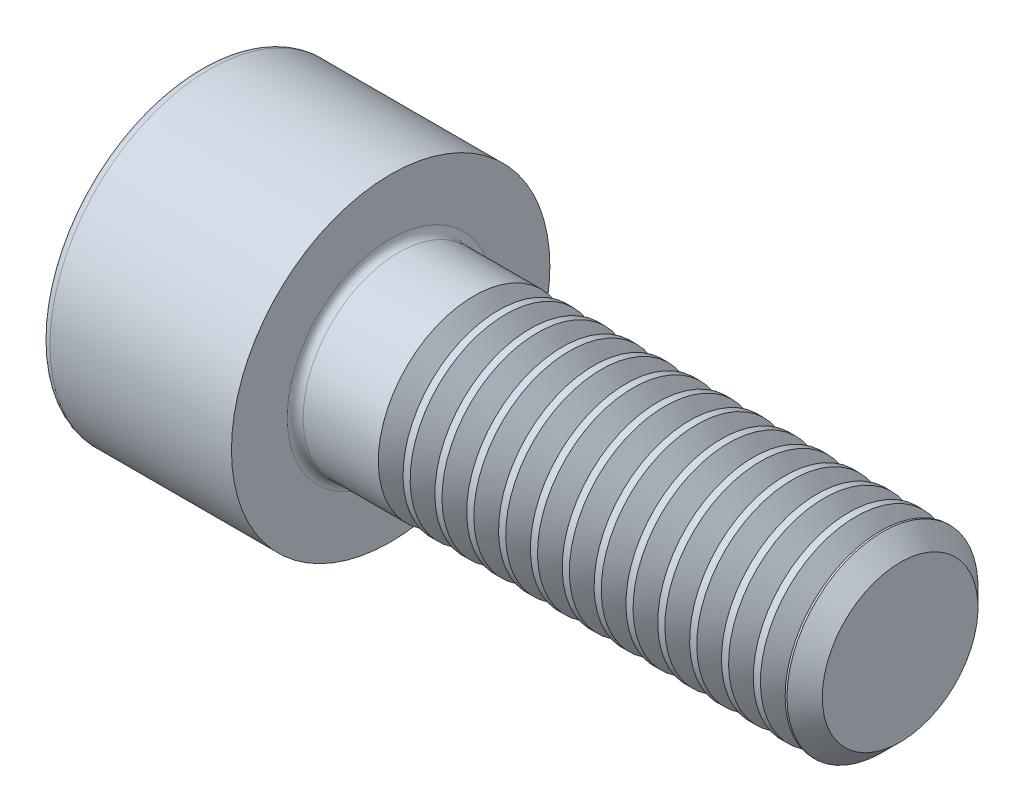
ISO-10303-21;
HEADER;
FILE_DESCRIPTION(('STEP AP214'),'2;1');
FILE_NAME('part.step','',(''),(''),'','','');
FILE_SCHEMA(('AUTOMOTIVE_DESIGN { 1 0 10303 214 1 1 1 1 }'));
ENDSEC;
DATA;
#1=APPLICATION_CONTEXT('core data for automotive mechanical design processes');
#2=APPLICATION_PROTOCOL_DEFINITION('international standard','automotive_design',2000,#1);
#3=PRODUCT_CONTEXT('',#1,'mechanical');
#4=PRODUCT('Part','Part','',(#3));
#5=PRODUCT_RELATED_PRODUCT_CATEGORY('part','',(#4));
#6=PRODUCT_DEFINITION_FORMATION('','',#4);
#7=PRODUCT_DEFINITION_CONTEXT('part definition',#1,'design');
#8=PRODUCT_DEFINITION('design','',#6,#7);
#9=PRODUCT_DEFINITION_SHAPE('','',#8);
#10=(LENGTH_UNIT() NAMED_UNIT(*) SI_UNIT(.MILLI.,.METRE.));
#11=(NAMED_UNIT(*) PLANE_ANGLE_UNIT() SI_UNIT($,.RADIAN.));
#12=(NAMED_UNIT(*) SI_UNIT($,.STERADIAN.) SOLID_ANGLE_UNIT());
#13=UNCERTAINTY_MEASURE_WITH_UNIT(LENGTH_MEASURE(1.E-05),#10,'distance_accuracy_value','');
#14=(GEOMETRIC_REPRESENTATION_CONTEXT(3) GLOBAL_UNCERTAINTY_ASSIGNED_CONTEXT((#13)) GLOBAL_UNIT_ASSIGNED_CONTEXT((#10,
#11,#12)) REPRESENTATION_CONTEXT('',''));
#15=CARTESIAN_POINT('',(0.,0.,0.));
#16=DIRECTION('',(0.,0.,1.));
#17=DIRECTION('',(1.,0.,0.));
#18=AXIS2_PLACEMENT_3D('',#15,#16,#17);
#19=CARTESIAN_POINT('',(0.,0.,0.));
#20=DIRECTION('',(-1.,0.,0.));
#21=DIRECTION('',(0.,0.,1.00000000000001));
#22=AXIS2_PLACEMENT_3D('',#19,#20,#21);
#23=PLANE('',#22);
#24=DIRECTION('',(0.,-0.500000000000004,0.866025403784444));
#25=VECTOR('',#24,1.);
#26=CARTESIAN_POINT('',(0.,2.93524876856003,0.));
#27=LINE('',#26,#25);
#28=CARTESIAN_POINT('',(0.,2.93524876856003,0.));
#29=VERTEX_POINT('',#28);
#30=CARTESIAN_POINT('',(0.,1.46762438428,2.54200000000003));
#31=VERTEX_POINT('',#30);
#32=EDGE_CURVE('E447',#29,#31,#27,.T.);
#33=ORIENTED_EDGE('',*,*,#32,.T.);
#34=DIRECTION('',(0.,1.00000000000001,0.));
#35=VECTOR('',#34,1.);
#36=CARTESIAN_POINT('',(0.,-1.46762438428003,2.54200000000004));
#37=LINE('',#36,#35);
#38=CARTESIAN_POINT('',(0.,-1.46762438428003,2.54200000000004));
#39=VERTEX_POINT('',#38);
#40=EDGE_CURVE('E112',#39,#31,#37,.T.);
#41=ORIENTED_EDGE('',*,*,#40,.F.);
#42=DIRECTION('',(0.,-0.500000000000003,-0.866025403784444));
#43=VECTOR('',#42,1.);
#44=CARTESIAN_POINT('',(0.,-1.46762438428003,2.54200000000004));
#45=LINE('',#44,#43);
#46=CARTESIAN_POINT('',(0.,-2.93524876856011,0.));
#47=VERTEX_POINT('',#46);
#48=EDGE_CURVE('E466',#39,#47,#45,.T.);
#49=ORIENTED_EDGE('',*,*,#48,.T.);
#50=DIRECTION('',(0.,0.500000000000004,-0.866025403784444));
#51=VECTOR('',#50,1.);
#52=CARTESIAN_POINT('',(0.,-2.93524876856011,0.));
#53=LINE('',#52,#51);
#54=CARTESIAN_POINT('',(0.,-1.46762438428007,-2.54199999999997));
#55=VERTEX_POINT('',#54);
#56=EDGE_CURVE('E469',#47,#55,#53,.T.);
#57=ORIENTED_EDGE('',*,*,#56,.T.);
#58=DIRECTION('',(0.,-1.00000000000001,0.));
#59=VECTOR('',#58,1.);
#60=CARTESIAN_POINT('',(0.,1.46762438428002,-2.54199999999998));
#61=LINE('',#60,#59);
#62=CARTESIAN_POINT('',(0.,1.46762438428002,-2.54199999999998));
#63=VERTEX_POINT('',#62);
#64=EDGE_CURVE('E472',#63,#55,#61,.T.);
#65=ORIENTED_EDGE('',*,*,#64,.F.);
#66=DIRECTION('',(0.,-0.500000000000003,-0.866025403784444));
#67=VECTOR('',#66,1.);
#68=CARTESIAN_POINT('',(0.,2.93524876856003,0.));
#69=LINE('',#68,#67);
#70=EDGE_CURVE('E107',#29,#63,#69,.T.);
#71=ORIENTED_EDGE('',*,*,#70,.F.);
#72=EDGE_LOOP('',(#33,#41,#49,#57,#65,#71));
#73=FACE_BOUND('',#72,.T.);
#74=CARTESIAN_POINT('',(0.,0.,0.));
#75=DIRECTION('',(-1.,0.,0.));
#76=DIRECTION('',(0.,0.,1.00000000000001));
#77=AXIS2_PLACEMENT_3D('',#74,#75,#76);
#78=CIRCLE('',#77,4.7);
#79=CARTESIAN_POINT('',(0.,0.,4.70000000000003));
#80=VERTEX_POINT('',#79);
#81=EDGE_CURVE('E24',#80,#80,#78,.T.);
#82=ORIENTED_EDGE('',*,*,#81,.T.);
#83=EDGE_LOOP('',(#82));
#84=FACE_BOUND('',#83,.T.);
#85=ADVANCED_FACE('F16',(#73,#84),#23,.T.);
#86=CARTESIAN_POINT('',(-31.75,0.,0.));
#87=DIRECTION('',(-1.,0.,0.));
#88=DIRECTION('',(0.,0.,1.00000000000001));
#89=AXIS2_PLACEMENT_3D('',#86,#87,#88);
#90=CYLINDRICAL_SURFACE('',#89,5.);
#91=CARTESIAN_POINT('',(0.299999999999995,0.,0.));
#92=DIRECTION('',(-1.,0.,0.));
#93=DIRECTION('',(0.,0.,1.00000000000001));
#94=AXIS2_PLACEMENT_3D('',#91,#92,#93);
#95=CIRCLE('',#94,5.);
#96=CARTESIAN_POINT('',(0.299999999999995,0.,5.00000000000003));
#97=VERTEX_POINT('',#96);
#98=EDGE_CURVE('E11',#97,#97,#95,.F.);
#99=ORIENTED_EDGE('',*,*,#98,.T.);
#100=EDGE_LOOP('',(#99));
#101=FACE_BOUND('',#100,.T.);
#102=CARTESIAN_POINT('',(6.00000000000001,0.,0.));
#103=DIRECTION('',(-1.,0.,0.));
#104=DIRECTION('',(0.,0.,1.00000000000001));
#105=AXIS2_PLACEMENT_3D('',#102,#103,#104);
#106=CIRCLE('',#105,5.);
#107=CARTESIAN_POINT('',(6.00000000000001,0.,5.00000000000003));
#108=VERTEX_POINT('',#107);
#109=EDGE_CURVE('E130',#108,#108,#106,.T.);
#110=ORIENTED_EDGE('',*,*,#109,.T.);
#111=EDGE_LOOP('',(#110));
#112=FACE_BOUND('',#111,.T.);
#113=ADVANCED_FACE('F156',(#101,#112),#90,.T.);
#114=CARTESIAN_POINT('',(6.00000000000001,5.00000000000001,0.));
#115=DIRECTION('',(1.,0.,0.));
#116=DIRECTION('',(0.,0.,-1.00000000000001));
#117=AXIS2_PLACEMENT_3D('',#114,#115,#116);
#118=PLANE('',#117);
#119=CARTESIAN_POINT('',(6.00000000000001,0.,0.));
#120=DIRECTION('',(1.,0.,0.));
#121=DIRECTION('',(0.,0.,-1.00000000000001));
#122=AXIS2_PLACEMENT_3D('',#119,#120,#121);
#123=CIRCLE('',#122,3.25);
#124=CARTESIAN_POINT('',(6.00000000000001,0.,-3.25000000000002));
#125=VERTEX_POINT('',#124);
#126=EDGE_CURVE('E133',#125,#125,#123,.F.);
#127=ORIENTED_EDGE('',*,*,#126,.T.);
#128=EDGE_LOOP('',(#127));
#129=FACE_BOUND('',#128,.T.);
#130=ORIENTED_EDGE('',*,*,#109,.F.);
#131=EDGE_LOOP('',(#130));
#132=FACE_BOUND('',#131,.T.);
#133=ADVANCED_FACE('F163',(#129,#132),#118,.T.);
#134=CARTESIAN_POINT('',(-31.75,0.,0.));
#135=DIRECTION('',(-1.,0.,0.));
#136=DIRECTION('',(0.,0.,1.00000000000001));
#137=AXIS2_PLACEMENT_3D('',#134,#135,#136);
#138=CYLINDRICAL_SURFACE('',#137,3.);
#139=CARTESIAN_POINT('',(8.6117349200627,0.,0.));
#140=DIRECTION('',(-1.,0.,0.));
#141=DIRECTION('',(0.,-1.00000000000001,0.));
#142=AXIS2_PLACEMENT_3D('',#139,#140,#141);
#143=CIRCLE('',#142,3.);
#144=CARTESIAN_POINT('',(8.6117349200627,-3.00000000000002,0.));
#145=VERTEX_POINT('',#144);
#146=EDGE_CURVE('E442',#145,#145,#143,.T.);
#147=ORIENTED_EDGE('',*,*,#146,.T.);
#148=EDGE_LOOP('',(#147));
#149=FACE_BOUND('',#148,.T.);
#150=CARTESIAN_POINT('',(6.25000000000001,0.,0.));
#151=DIRECTION('',(1.,0.,0.));
#152=DIRECTION('',(0.,0.,-1.00000000000001));
#153=AXIS2_PLACEMENT_3D('',#150,#151,#152);
#154=CIRCLE('',#153,3.);
#155=CARTESIAN_POINT('',(6.25000000000001,0.,-3.00000000000002));
#156=VERTEX_POINT('',#155);
#157=EDGE_CURVE('E136',#156,#156,#154,.T.);
#158=ORIENTED_EDGE('',*,*,#157,.T.);
#159=EDGE_LOOP('',(#158));
#160=FACE_BOUND('',#159,.T.);
#161=ADVANCED_FACE('F152',(#149,#160),#138,.T.);
#162=CARTESIAN_POINT('',(6.25000000000001,0.,0.));
#163=DIRECTION('',(1.,0.,0.));
#164=DIRECTION('',(0.,0.,-1.00000000000001));
#165=AXIS2_PLACEMENT_3D('',#162,#163,#164);
#166=TOROIDAL_SURFACE('',#165,3.25,0.25);
#167=ORIENTED_EDGE('',*,*,#157,.F.);
#168=EDGE_LOOP('',(#167));
#169=FACE_BOUND('',#168,.T.);
#170=ORIENTED_EDGE('',*,*,#126,.F.);
#171=EDGE_LOOP('',(#170));
#172=FACE_BOUND('',#171,.T.);
#173=ADVANCED_FACE('F143',(#169,#172),#166,.F.);
#174=CARTESIAN_POINT('',(0.299999999999995,0.,0.));
#175=DIRECTION('',(-1.,0.,0.));
#176=DIRECTION('',(0.,0.,1.00000000000001));
#177=AXIS2_PLACEMENT_3D('',#174,#175,#176);
#178=TOROIDAL_SURFACE('',#177,4.7,0.3);
#179=ORIENTED_EDGE('',*,*,#98,.F.);
#180=EDGE_LOOP('',(#179));
#181=FACE_BOUND('',#180,.T.);
#182=ORIENTED_EDGE('',*,*,#81,.F.);
#183=EDGE_LOOP('',(#182));
#184=FACE_BOUND('',#183,.T.);
#185=ADVANCED_FACE('F18',(#181,#184),#178,.T.);
#186=CARTESIAN_POINT('',(3.,2.93524876856003,0.));
#187=DIRECTION('',(0.,-0.866025403784445,-0.500000000000003));
#188=DIRECTION('',(0.,0.500000000000003,-0.866025403784445));
#189=AXIS2_PLACEMENT_3D('',#186,#187,#188);
#190=PLANE('',#189);
#191=ORIENTED_EDGE('',*,*,#32,.F.);
#192=DIRECTION('',(-1.,0.,0.));
#193=VECTOR('',#192,1.);
#194=CARTESIAN_POINT('',(3.,2.93524876856003,0.));
#195=LINE('',#194,#193);
#196=CARTESIAN_POINT('',(3.,2.93524876856003,0.));
#197=VERTEX_POINT('',#196);
#198=EDGE_CURVE('E463',#197,#29,#195,.T.);
#199=ORIENTED_EDGE('',*,*,#198,.F.);
#200=DIRECTION('',(0.,-0.500000000000004,0.866025403784444));
#201=VECTOR('',#200,1.);
#202=CARTESIAN_POINT('',(3.,2.93524876856003,0.));
#203=LINE('',#202,#201);
#204=CARTESIAN_POINT('',(3.,2.20143657642002,1.27100000000004));
#205=VERTEX_POINT('',#204);
#206=EDGE_CURVE('E99',#197,#205,#203,.T.);
#207=ORIENTED_EDGE('',*,*,#206,.T.);
#208=CARTESIAN_POINT('',(3.,1.46762438428,2.54200000000003));
#209=VERTEX_POINT('',#208);
#210=EDGE_CURVE('E90',#205,#209,#203,.T.);
#211=ORIENTED_EDGE('',*,*,#210,.T.);
#212=DIRECTION('',(-1.,0.,0.));
#213=VECTOR('',#212,1.);
#214=CARTESIAN_POINT('',(3.,1.46762438428,2.54200000000003));
#215=LINE('',#214,#213);
#216=EDGE_CURVE('E104',#209,#31,#215,.T.);
#217=ORIENTED_EDGE('',*,*,#216,.T.);
#218=EDGE_LOOP('',(#191,#199,#207,#211,#217));
#219=FACE_BOUND('',#218,.T.);
#220=ADVANCED_FACE('F103',(#219),#190,.T.);
#221=CARTESIAN_POINT('',(3.,-1.46762438428003,2.54200000000004));
#222=DIRECTION('',(0.,0.,1.00000000000001));
#223=DIRECTION('',(0.,-1.00000000000001,0.));
#224=AXIS2_PLACEMENT_3D('',#221,#222,#223);
#225=PLANE('',#224);
#226=ORIENTED_EDGE('',*,*,#40,.T.);
#227=ORIENTED_EDGE('',*,*,#216,.F.);
#228=DIRECTION('',(0.,1.00000000000001,0.));
#229=VECTOR('',#228,1.);
#230=CARTESIAN_POINT('',(3.,-1.46762438428003,2.54200000000004));
#231=LINE('',#230,#229);
#232=CARTESIAN_POINT('',(3.,0.,2.542));
#233=VERTEX_POINT('',#232);
#234=EDGE_CURVE('E87',#233,#209,#231,.T.);
#235=ORIENTED_EDGE('',*,*,#234,.F.);
#236=CARTESIAN_POINT('',(3.,-1.46762438428003,2.54200000000004));
#237=VERTEX_POINT('',#236);
#238=EDGE_CURVE('E98',#237,#233,#231,.T.);
#239=ORIENTED_EDGE('',*,*,#238,.F.);
#240=DIRECTION('',(-1.,0.,0.));
#241=VECTOR('',#240,1.);
#242=CARTESIAN_POINT('',(3.,-1.46762438428003,2.54200000000004));
#243=LINE('',#242,#241);
#244=EDGE_CURVE('E114',#237,#39,#243,.T.);
#245=ORIENTED_EDGE('',*,*,#244,.T.);
#246=EDGE_LOOP('',(#226,#227,#235,#239,#245));
#247=FACE_BOUND('',#246,.T.);
#248=ADVANCED_FACE('F109',(#247),#225,.F.);
#249=CARTESIAN_POINT('',(3.,-1.46762438428003,2.54200000000004));
#250=DIRECTION('',(0.,0.866025403784444,-0.500000000000003));
#251=DIRECTION('',(0.,0.500000000000003,0.866025403784444));
#252=AXIS2_PLACEMENT_3D('',#249,#250,#251);
#253=PLANE('',#252);
#254=ORIENTED_EDGE('',*,*,#48,.F.);
#255=ORIENTED_EDGE('',*,*,#244,.F.);
#256=DIRECTION('',(0.,-0.500000000000003,-0.866025403784444));
#257=VECTOR('',#256,1.);
#258=CARTESIAN_POINT('',(3.,-1.46762438428003,2.54200000000004));
#259=LINE('',#258,#257);
#260=CARTESIAN_POINT('',(3.,-2.20143657642007,1.27100000000001));
#261=VERTEX_POINT('',#260);
#262=EDGE_CURVE('E450',#237,#261,#259,.T.);
#263=ORIENTED_EDGE('',*,*,#262,.T.);
#264=CARTESIAN_POINT('',(3.,-2.93524876856011,0.));
#265=VERTEX_POINT('',#264);
#266=EDGE_CURVE('E449',#261,#265,#259,.T.);
#267=ORIENTED_EDGE('',*,*,#266,.T.);
#268=DIRECTION('',(-1.,0.,0.));
#269=VECTOR('',#268,1.);
#270=CARTESIAN_POINT('',(3.,-2.93524876856011,0.));
#271=LINE('',#270,#269);
#272=EDGE_CURVE('E119',#265,#47,#271,.T.);
#273=ORIENTED_EDGE('',*,*,#272,.T.);
#274=EDGE_LOOP('',(#254,#255,#263,#267,#273));
#275=FACE_BOUND('',#274,.T.);
#276=ADVANCED_FACE('F191',(#275),#253,.T.);
#277=CARTESIAN_POINT('',(3.,-2.93524876856011,0.));
#278=DIRECTION('',(0.,0.866025403784445,0.500000000000003));
#279=DIRECTION('',(0.,-0.500000000000003,0.866025403784445));
#280=AXIS2_PLACEMENT_3D('',#277,#278,#279);
#281=PLANE('',#280);
#282=ORIENTED_EDGE('',*,*,#56,.F.);
#283=ORIENTED_EDGE('',*,*,#272,.F.);
#284=DIRECTION('',(0.,0.500000000000004,-0.866025403784444));
#285=VECTOR('',#284,1.);
#286=CARTESIAN_POINT('',(3.,-2.93524876856011,0.));
#287=LINE('',#286,#285);
#288=CARTESIAN_POINT('',(3.,-2.2014365764201,-1.271));
#289=VERTEX_POINT('',#288);
#290=EDGE_CURVE('E454',#265,#289,#287,.T.);
#291=ORIENTED_EDGE('',*,*,#290,.T.);
#292=CARTESIAN_POINT('',(3.,-1.46762438428007,-2.54199999999997));
#293=VERTEX_POINT('',#292);
#294=EDGE_CURVE('E453',#289,#293,#287,.T.);
#295=ORIENTED_EDGE('',*,*,#294,.T.);
#296=DIRECTION('',(-1.,0.,0.));
#297=VECTOR('',#296,1.);
#298=CARTESIAN_POINT('',(3.,-1.46762438428007,-2.54199999999997));
#299=LINE('',#298,#297);
#300=EDGE_CURVE('E481',#293,#55,#299,.T.);
#301=ORIENTED_EDGE('',*,*,#300,.T.);
#302=EDGE_LOOP('',(#282,#283,#291,#295,#301));
#303=FACE_BOUND('',#302,.T.);
#304=ADVANCED_FACE('F194',(#303),#281,.T.);
#305=CARTESIAN_POINT('',(3.,1.46762438428002,-2.54199999999998));
#306=DIRECTION('',(0.,0.,-1.00000000000001));
#307=DIRECTION('',(0.,1.00000000000001,0.));
#308=AXIS2_PLACEMENT_3D('',#305,#306,#307);
#309=PLANE('',#308);
#310=ORIENTED_EDGE('',*,*,#64,.T.);
#311=ORIENTED_EDGE('',*,*,#300,.F.);
#312=DIRECTION('',(0.,-1.00000000000001,0.));
#313=VECTOR('',#312,1.);
#314=CARTESIAN_POINT('',(3.,1.46762438428002,-2.54199999999998));
#315=LINE('',#314,#313);
#316=CARTESIAN_POINT('',(3.,0.,-2.54199999999999));
#317=VERTEX_POINT('',#316);
#318=EDGE_CURVE('E457',#317,#293,#315,.T.);
#319=ORIENTED_EDGE('',*,*,#318,.F.);
#320=CARTESIAN_POINT('',(3.,1.46762438428002,-2.54199999999998));
#321=VERTEX_POINT('',#320);
#322=EDGE_CURVE('E31',#321,#317,#315,.T.);
#323=ORIENTED_EDGE('',*,*,#322,.F.);
#324=DIRECTION('',(-1.,0.,0.));
#325=VECTOR('',#324,1.);
#326=CARTESIAN_POINT('',(3.,1.46762438428002,-2.54199999999998));
#327=LINE('',#326,#325);
#328=EDGE_CURVE('E478',#321,#63,#327,.T.);
#329=ORIENTED_EDGE('',*,*,#328,.T.);
#330=EDGE_LOOP('',(#310,#311,#319,#323,#329));
#331=FACE_BOUND('',#330,.T.);
#332=ADVANCED_FACE('F198',(#331),#309,.F.);
#333=CARTESIAN_POINT('',(3.,2.93524876856003,0.));
#334=DIRECTION('',(0.,0.866025403784444,-0.500000000000003));
#335=DIRECTION('',(0.,0.500000000000003,0.866025403784444));
#336=AXIS2_PLACEMENT_3D('',#333,#334,#335);
#337=PLANE('',#336);
#338=ORIENTED_EDGE('',*,*,#70,.T.);
#339=ORIENTED_EDGE('',*,*,#328,.F.);
#340=DIRECTION('',(0.,-0.500000000000003,-0.866025403784444));
#341=VECTOR('',#340,1.);
#342=CARTESIAN_POINT('',(3.,2.93524876856003,0.));
#343=LINE('',#342,#341);
#344=CARTESIAN_POINT('',(3.,2.20143657642002,-1.27099999999997));
#345=VERTEX_POINT('',#344);
#346=EDGE_CURVE('E459',#345,#321,#343,.T.);
#347=ORIENTED_EDGE('',*,*,#346,.F.);
#348=EDGE_CURVE('E460',#197,#345,#343,.T.);
#349=ORIENTED_EDGE('',*,*,#348,.F.);
#350=ORIENTED_EDGE('',*,*,#198,.T.);
#351=EDGE_LOOP('',(#338,#339,#347,#349,#350));
#352=FACE_BOUND('',#351,.T.);
#353=ADVANCED_FACE('F202',(#352),#337,.F.);
#354=CARTESIAN_POINT('',(3.,4.40287315284007,-2.54199999999999));
#355=DIRECTION('',(1.,0.,0.));
#356=DIRECTION('',(0.,0.,-1.00000000000001));
#357=AXIS2_PLACEMENT_3D('',#354,#355,#356);
#358=PLANE('',#357);
#359=ORIENTED_EDGE('',*,*,#318,.T.);
#360=ORIENTED_EDGE('',*,*,#294,.F.);
#361=CARTESIAN_POINT('',(3.,0.,0.));
#362=DIRECTION('',(-1.,0.,0.));
#363=DIRECTION('',(0.,0.,1.00000000000001));
#364=AXIS2_PLACEMENT_3D('',#361,#362,#363);
#365=CIRCLE('',#364,2.542);
#366=EDGE_CURVE('E498',#317,#289,#365,.T.);
#367=ORIENTED_EDGE('',*,*,#366,.F.);
#368=EDGE_LOOP('',(#359,#360,#367));
#369=FACE_BOUND('',#368,.T.);
#370=ADVANCED_FACE('F206',(#369),#358,.F.);
#371=ORIENTED_EDGE('',*,*,#290,.F.);
#372=ORIENTED_EDGE('',*,*,#266,.F.);
#373=EDGE_CURVE('E117',#289,#261,#365,.T.);
#374=ORIENTED_EDGE('',*,*,#373,.F.);
#375=EDGE_LOOP('',(#371,#372,#374));
#376=FACE_BOUND('',#375,.T.);
#377=ADVANCED_FACE('F210',(#376),#358,.F.);
#378=ORIENTED_EDGE('',*,*,#262,.F.);
#379=ORIENTED_EDGE('',*,*,#238,.T.);
#380=EDGE_CURVE('E113',#261,#233,#365,.T.);
#381=ORIENTED_EDGE('',*,*,#380,.F.);
#382=EDGE_LOOP('',(#378,#379,#381));
#383=FACE_BOUND('',#382,.T.);
#384=ADVANCED_FACE('F507',(#383),#358,.F.);
#385=ORIENTED_EDGE('',*,*,#234,.T.);
#386=ORIENTED_EDGE('',*,*,#210,.F.);
#387=EDGE_CURVE('E93',#233,#205,#365,.T.);
#388=ORIENTED_EDGE('',*,*,#387,.F.);
#389=EDGE_LOOP('',(#385,#386,#388));
#390=FACE_BOUND('',#389,.T.);
#391=ADVANCED_FACE('F89',(#390),#358,.F.);
#392=ORIENTED_EDGE('',*,*,#206,.F.);
#393=ORIENTED_EDGE('',*,*,#348,.T.);
#394=EDGE_CURVE('E124',#205,#345,#365,.T.);
#395=ORIENTED_EDGE('',*,*,#394,.F.);
#396=EDGE_LOOP('',(#392,#393,#395));
#397=FACE_BOUND('',#396,.T.);
#398=ADVANCED_FACE('F493',(#397),#358,.F.);
#399=ORIENTED_EDGE('',*,*,#346,.T.);
#400=ORIENTED_EDGE('',*,*,#322,.T.);
#401=EDGE_CURVE('E497',#345,#317,#365,.T.);
#402=ORIENTED_EDGE('',*,*,#401,.F.);
#403=EDGE_LOOP('',(#399,#400,#402));
#404=FACE_BOUND('',#403,.T.);
#405=ADVANCED_FACE('F187',(#404),#358,.F.);
#406=CARTESIAN_POINT('',(3.,0.,0.));
#407=DIRECTION('',(-1.,0.,0.));
#408=DIRECTION('',(0.,0.,1.00000000000001));
#409=AXIS2_PLACEMENT_3D('',#406,#407,#408);
#410=CONICAL_SURFACE('',#409,2.542,1.0471975511966);
#411=CARTESIAN_POINT('',(4.46762438428006,0.,0.));
#412=VERTEX_POINT('',#411);
#413=VERTEX_LOOP('',#412);
#414=FACE_BOUND('',#413,.T.);
#415=ORIENTED_EDGE('',*,*,#387,.T.);
#416=ORIENTED_EDGE('',*,*,#394,.T.);
#417=ORIENTED_EDGE('',*,*,#401,.T.);
#418=ORIENTED_EDGE('',*,*,#366,.T.);
#419=ORIENTED_EDGE('',*,*,#373,.T.);
#420=ORIENTED_EDGE('',*,*,#380,.T.);
#421=EDGE_LOOP('',(#415,#416,#417,#418,#419,#420));
#422=FACE_BOUND('',#421,.T.);
#423=ADVANCED_FACE('F184',(#414,#422),#410,.F.);
#424=CARTESIAN_POINT('',(9.38826507993729,0.,0.));
#425=DIRECTION('',(1.,0.,0.));
#426=DIRECTION('',(0.,1.00000000000001,0.));
#427=AXIS2_PLACEMENT_3D('',#424,#425,#426);
#428=CONICAL_SURFACE('',#427,3.,0.959931088596881);
#429=CARTESIAN_POINT('',(9.00000000000001,0.,0.));
#430=DIRECTION('',(-1.,0.,0.));
#431=DIRECTION('',(0.,-1.00000000000001,0.));
#432=AXIS2_PLACEMENT_3D('',#429,#430,#431);
#433=CIRCLE('',#432,2.4455);
#434=CARTESIAN_POINT('',(9.00000000000001,-2.44550000000002,0.));
#435=VERTEX_POINT('',#434);
#436=EDGE_CURVE('E439',#435,#435,#433,.T.);
#437=ORIENTED_EDGE('',*,*,#436,.F.);
#438=EDGE_LOOP('',(#437));
#439=FACE_BOUND('',#438,.T.);
#440=CARTESIAN_POINT('',(9.38826507993729,0.,0.));
#441=DIRECTION('',(-1.,0.,0.));
#442=DIRECTION('',(0.,-1.00000000000001,0.));
#443=AXIS2_PLACEMENT_3D('',#440,#441,#442);
#444=CIRCLE('',#443,3.);
#445=CARTESIAN_POINT('',(9.38826507993729,-3.00000000000002,0.));
#446=VERTEX_POINT('',#445);
#447=EDGE_CURVE('E445',#446,#446,#444,.T.);
#448=ORIENTED_EDGE('',*,*,#447,.T.);
#449=EDGE_LOOP('',(#448));
#450=FACE_BOUND('',#449,.T.);
#451=ADVANCED_FACE('F186',(#439,#450),#428,.T.);
#452=CARTESIAN_POINT('',(9.00000000000001,0.,0.));
#453=DIRECTION('',(-1.,0.,0.));
#454=DIRECTION('',(0.,-1.00000000000001,0.));
#455=AXIS2_PLACEMENT_3D('',#452,#453,#454);
#456=CONICAL_SURFACE('',#455,2.4455,0.959931088596877);
#457=ORIENTED_EDGE('',*,*,#146,.F.);
#458=EDGE_LOOP('',(#457));
#459=FACE_BOUND('',#458,.T.);
#460=ORIENTED_EDGE('',*,*,#436,.T.);
#461=EDGE_LOOP('',(#460));
#462=FACE_BOUND('',#461,.T.);
#463=ADVANCED_FACE('F214',(#459,#462),#456,.T.);
#464=CARTESIAN_POINT('',(9.6117349200627,0.,0.));
#465=DIRECTION('',(-1.,0.,0.));
#466=DIRECTION('',(0.,-1.00000000000001,0.));
#467=AXIS2_PLACEMENT_3D('',#464,#465,#466);
#468=CIRCLE('',#467,3.);
#469=CARTESIAN_POINT('',(9.6117349200627,-3.00000000000002,0.));
#470=VERTEX_POINT('',#469);
#471=EDGE_CURVE('E433',#470,#470,#468,.T.);
#472=ORIENTED_EDGE('',*,*,#471,.T.);
#473=EDGE_LOOP('',(#472));
#474=FACE_BOUND('',#473,.T.);
#475=ORIENTED_EDGE('',*,*,#447,.F.);
#476=EDGE_LOOP('',(#475));
#477=FACE_BOUND('',#476,.T.);
#478=ADVANCED_FACE('F174',(#474,#477),#138,.T.);
#479=CARTESIAN_POINT('',(10.3882650799373,0.,0.));
#480=DIRECTION('',(1.,0.,0.));
#481=DIRECTION('',(0.,1.00000000000001,0.));
#482=AXIS2_PLACEMENT_3D('',#479,#480,#481);
#483=CONICAL_SURFACE('',#482,3.,0.959931088596881);
#484=CARTESIAN_POINT('',(10.,0.,0.));
#485=DIRECTION('',(-1.,0.,0.));
#486=DIRECTION('',(0.,-1.00000000000001,0.));
#487=AXIS2_PLACEMENT_3D('',#484,#485,#486);
#488=CIRCLE('',#487,2.4455);
#489=CARTESIAN_POINT('',(10.,-2.44550000000002,0.));
#490=VERTEX_POINT('',#489);
#491=EDGE_CURVE('E430',#490,#490,#488,.T.);
#492=ORIENTED_EDGE('',*,*,#491,.F.);
#493=EDGE_LOOP('',(#492));
#494=FACE_BOUND('',#493,.T.);
#495=CARTESIAN_POINT('',(10.3882650799373,0.,0.));
#496=DIRECTION('',(-1.,0.,0.));
#497=DIRECTION('',(0.,-1.00000000000001,0.));
#498=AXIS2_PLACEMENT_3D('',#495,#496,#497);
#499=CIRCLE('',#498,3.);
#500=CARTESIAN_POINT('',(10.3882650799373,-3.00000000000002,0.));
#501=VERTEX_POINT('',#500);
#502=EDGE_CURVE('E436',#501,#501,#499,.T.);
#503=ORIENTED_EDGE('',*,*,#502,.T.);
#504=EDGE_LOOP('',(#503));
#505=FACE_BOUND('',#504,.T.);
#506=ADVANCED_FACE('F219',(#494,#505),#483,.T.);
#507=CARTESIAN_POINT('',(10.,0.,0.));
#508=DIRECTION('',(-1.,0.,0.));
#509=DIRECTION('',(0.,-1.00000000000001,0.));
#510=AXIS2_PLACEMENT_3D('',#507,#508,#509);
#511=CONICAL_SURFACE('',#510,2.4455,0.959931088596877);
#512=ORIENTED_EDGE('',*,*,#471,.F.);
#513=EDGE_LOOP('',(#512));
#514=FACE_BOUND('',#513,.T.);
#515=ORIENTED_EDGE('',*,*,#491,.T.);
#516=EDGE_LOOP('',(#515));
#517=FACE_BOUND('',#516,.T.);
#518=ADVANCED_FACE('F222',(#514,#517),#511,.T.);
#519=CARTESIAN_POINT('',(10.6117349200627,0.,0.));
#520=DIRECTION('',(-1.,0.,0.));
#521=DIRECTION('',(0.,-1.00000000000001,0.));
#522=AXIS2_PLACEMENT_3D('',#519,#520,#521);
#523=CIRCLE('',#522,3.);
#524=CARTESIAN_POINT('',(10.6117349200627,-3.00000000000002,0.));
#525=VERTEX_POINT('',#524);
#526=EDGE_CURVE('E424',#525,#525,#523,.T.);
#527=ORIENTED_EDGE('',*,*,#526,.T.);
#528=EDGE_LOOP('',(#527));
#529=FACE_BOUND('',#528,.T.);
#530=ORIENTED_EDGE('',*,*,#502,.F.);
#531=EDGE_LOOP('',(#530));
#532=FACE_BOUND('',#531,.T.);
#533=ADVANCED_FACE('F226',(#529,#532),#138,.T.);
#534=CARTESIAN_POINT('',(11.3882650799373,0.,0.));
#535=DIRECTION('',(1.,0.,0.));
#536=DIRECTION('',(0.,1.00000000000001,0.));
#537=AXIS2_PLACEMENT_3D('',#534,#535,#536);
#538=CONICAL_SURFACE('',#537,3.,0.959931088596881);
#539=CARTESIAN_POINT('',(11.,0.,0.));
#540=DIRECTION('',(-1.,0.,0.));
#541=DIRECTION('',(0.,-1.00000000000001,0.));
#542=AXIS2_PLACEMENT_3D('',#539,#540,#541);
#543=CIRCLE('',#542,2.4455);
#544=CARTESIAN_POINT('',(11.,-2.44550000000002,0.));
#545=VERTEX_POINT('',#544);
#546=EDGE_CURVE('E421',#545,#545,#543,.T.);
#547=ORIENTED_EDGE('',*,*,#546,.F.);
#548=EDGE_LOOP('',(#547));
#549=FACE_BOUND('',#548,.T.);
#550=CARTESIAN_POINT('',(11.3882650799373,0.,0.));
#551=DIRECTION('',(-1.,0.,0.));
#552=DIRECTION('',(0.,-1.00000000000001,0.));
#553=AXIS2_PLACEMENT_3D('',#550,#551,#552);
#554=CIRCLE('',#553,3.);
#555=CARTESIAN_POINT('',(11.3882650799373,-3.00000000000002,0.));
#556=VERTEX_POINT('',#555);
#557=EDGE_CURVE('E427',#556,#556,#554,.T.);
#558=ORIENTED_EDGE('',*,*,#557,.T.);
#559=EDGE_LOOP('',(#558));
#560=FACE_BOUND('',#559,.T.);
#561=ADVANCED_FACE('F228',(#549,#560),#538,.T.);
#562=CARTESIAN_POINT('',(11.,0.,0.));
#563=DIRECTION('',(-1.,0.,0.));
#564=DIRECTION('',(0.,-1.00000000000001,0.));
#565=AXIS2_PLACEMENT_3D('',#562,#563,#564);
#566=CONICAL_SURFACE('',#565,2.4455,0.959931088596877);
#567=ORIENTED_EDGE('',*,*,#526,.F.);
#568=EDGE_LOOP('',(#567));
#569=FACE_BOUND('',#568,.T.);
#570=ORIENTED_EDGE('',*,*,#546,.T.);
#571=EDGE_LOOP('',(#570));
#572=FACE_BOUND('',#571,.T.);
#573=ADVANCED_FACE('F231',(#569,#572),#566,.T.);
#574=CARTESIAN_POINT('',(11.6117349200627,0.,0.));
#575=DIRECTION('',(-1.,0.,0.));
#576=DIRECTION('',(0.,-1.00000000000001,0.));
#577=AXIS2_PLACEMENT_3D('',#574,#575,#576);
#578=CIRCLE('',#577,3.);
#579=CARTESIAN_POINT('',(11.6117349200627,-3.00000000000002,0.));
#580=VERTEX_POINT('',#579);
#581=EDGE_CURVE('E415',#580,#580,#578,.T.);
#582=ORIENTED_EDGE('',*,*,#581,.T.);
#583=EDGE_LOOP('',(#582));
#584=FACE_BOUND('',#583,.T.);
#585=ORIENTED_EDGE('',*,*,#557,.F.);
#586=EDGE_LOOP('',(#585));
#587=FACE_BOUND('',#586,.T.);
#588=ADVANCED_FACE('F235',(#584,#587),#138,.T.);
#589=CARTESIAN_POINT('',(12.3882650799373,0.,0.));
#590=DIRECTION('',(1.,0.,0.));
#591=DIRECTION('',(0.,1.00000000000001,0.));
#592=AXIS2_PLACEMENT_3D('',#589,#590,#591);
#593=CONICAL_SURFACE('',#592,3.,0.959931088596881);
#594=CARTESIAN_POINT('',(12.,0.,0.));
#595=DIRECTION('',(-1.,0.,0.));
#596=DIRECTION('',(0.,-1.00000000000001,0.));
#597=AXIS2_PLACEMENT_3D('',#594,#595,#596);
#598=CIRCLE('',#597,2.4455);
#599=CARTESIAN_POINT('',(12.,-2.44550000000002,0.));
#600=VERTEX_POINT('',#599);
#601=EDGE_CURVE('E412',#600,#600,#598,.T.);
#602=ORIENTED_EDGE('',*,*,#601,.F.);
#603=EDGE_LOOP('',(#602));
#604=FACE_BOUND('',#603,.T.);
#605=CARTESIAN_POINT('',(12.3882650799373,0.,0.));
#606=DIRECTION('',(-1.,0.,0.));
#607=DIRECTION('',(0.,-1.00000000000001,0.));
#608=AXIS2_PLACEMENT_3D('',#605,#606,#607);
#609=CIRCLE('',#608,3.);
#610=CARTESIAN_POINT('',(12.3882650799373,-3.00000000000002,0.));
#611=VERTEX_POINT('',#610);
#612=EDGE_CURVE('E418',#611,#611,#609,.T.);
#613=ORIENTED_EDGE('',*,*,#612,.T.);
#614=EDGE_LOOP('',(#613));
#615=FACE_BOUND('',#614,.T.);
#616=ADVANCED_FACE('F237',(#604,#615),#593,.T.);
#617=CARTESIAN_POINT('',(12.,0.,0.));
#618=DIRECTION('',(-1.,0.,0.));
#619=DIRECTION('',(0.,-1.00000000000001,0.));
#620=AXIS2_PLACEMENT_3D('',#617,#618,#619);
#621=CONICAL_SURFACE('',#620,2.4455,0.959931088596877);
#622=ORIENTED_EDGE('',*,*,#581,.F.);
#623=EDGE_LOOP('',(#622));
#624=FACE_BOUND('',#623,.T.);
#625=ORIENTED_EDGE('',*,*,#601,.T.);
#626=EDGE_LOOP('',(#625));
#627=FACE_BOUND('',#626,.T.);
#628=ADVANCED_FACE('F240',(#624,#627),#621,.T.);
#629=CARTESIAN_POINT('',(12.6117349200627,0.,0.));
#630=DIRECTION('',(-1.,0.,0.));
#631=DIRECTION('',(0.,-1.00000000000001,0.));
#632=AXIS2_PLACEMENT_3D('',#629,#630,#631);
#633=CIRCLE('',#632,3.);
#634=CARTESIAN_POINT('',(12.6117349200627,-3.00000000000002,0.));
#635=VERTEX_POINT('',#634);
#636=EDGE_CURVE('E406',#635,#635,#633,.T.);
#637=ORIENTED_EDGE('',*,*,#636,.T.);
#638=EDGE_LOOP('',(#637));
#639=FACE_BOUND('',#638,.T.);
#640=ORIENTED_EDGE('',*,*,#612,.F.);
#641=EDGE_LOOP('',(#640));
#642=FACE_BOUND('',#641,.T.);
#643=ADVANCED_FACE('F244',(#639,#642),#138,.T.);
#644=CARTESIAN_POINT('',(13.3882650799373,0.,0.));
#645=DIRECTION('',(1.,0.,0.));
#646=DIRECTION('',(0.,1.00000000000001,0.));
#647=AXIS2_PLACEMENT_3D('',#644,#645,#646);
#648=CONICAL_SURFACE('',#647,3.,0.959931088596881);
#649=CARTESIAN_POINT('',(13.,0.,0.));
#650=DIRECTION('',(-1.,0.,0.));
#651=DIRECTION('',(0.,-1.00000000000001,0.));
#652=AXIS2_PLACEMENT_3D('',#649,#650,#651);
#653=CIRCLE('',#652,2.4455);
#654=CARTESIAN_POINT('',(13.,-2.44550000000002,0.));
#655=VERTEX_POINT('',#654);
#656=EDGE_CURVE('E403',#655,#655,#653,.T.);
#657=ORIENTED_EDGE('',*,*,#656,.F.);
#658=EDGE_LOOP('',(#657));
#659=FACE_BOUND('',#658,.T.);
#660=CARTESIAN_POINT('',(13.3882650799373,0.,0.));
#661=DIRECTION('',(-1.,0.,0.));
#662=DIRECTION('',(0.,-1.00000000000001,0.));
#663=AXIS2_PLACEMENT_3D('',#660,#661,#662);
#664=CIRCLE('',#663,3.);
#665=CARTESIAN_POINT('',(13.3882650799373,-3.00000000000002,0.));
#666=VERTEX_POINT('',#665);
#667=EDGE_CURVE('E409',#666,#666,#664,.T.);
#668=ORIENTED_EDGE('',*,*,#667,.T.);
#669=EDGE_LOOP('',(#668));
#670=FACE_BOUND('',#669,.T.);
#671=ADVANCED_FACE('F246',(#659,#670),#648,.T.);
#672=CARTESIAN_POINT('',(13.,0.,0.));
#673=DIRECTION('',(-1.,0.,0.));
#674=DIRECTION('',(0.,-1.00000000000001,0.));
#675=AXIS2_PLACEMENT_3D('',#672,#673,#674);
#676=CONICAL_SURFACE('',#675,2.4455,0.959931088596877);
#677=ORIENTED_EDGE('',*,*,#636,.F.);
#678=EDGE_LOOP('',(#677));
#679=FACE_BOUND('',#678,.T.);
#680=ORIENTED_EDGE('',*,*,#656,.T.);
#681=EDGE_LOOP('',(#680));
#682=FACE_BOUND('',#681,.T.);
#683=ADVANCED_FACE('F249',(#679,#682),#676,.T.);
#684=CARTESIAN_POINT('',(13.6117349200627,0.,0.));
#685=DIRECTION('',(-1.,0.,0.));
#686=DIRECTION('',(0.,-1.00000000000001,0.));
#687=AXIS2_PLACEMENT_3D('',#684,#685,#686);
#688=CIRCLE('',#687,3.);
#689=CARTESIAN_POINT('',(13.6117349200627,-3.00000000000002,0.));
#690=VERTEX_POINT('',#689);
#691=EDGE_CURVE('E397',#690,#690,#688,.T.);
#692=ORIENTED_EDGE('',*,*,#691,.T.);
#693=EDGE_LOOP('',(#692));
#694=FACE_BOUND('',#693,.T.);
#695=ORIENTED_EDGE('',*,*,#667,.F.);
#696=EDGE_LOOP('',(#695));
#697=FACE_BOUND('',#696,.T.);
#698=ADVANCED_FACE('F253',(#694,#697),#138,.T.);
#699=CARTESIAN_POINT('',(14.3882650799373,0.,0.));
#700=DIRECTION('',(1.,0.,0.));
#701=DIRECTION('',(0.,1.00000000000001,0.));
#702=AXIS2_PLACEMENT_3D('',#699,#700,#701);
#703=CONICAL_SURFACE('',#702,3.,0.959931088596881);
#704=CARTESIAN_POINT('',(14.,0.,0.));
#705=DIRECTION('',(-1.,0.,0.));
#706=DIRECTION('',(0.,-1.00000000000001,0.));
#707=AXIS2_PLACEMENT_3D('',#704,#705,#706);
#708=CIRCLE('',#707,2.4455);
#709=CARTESIAN_POINT('',(14.,-2.44550000000002,0.));
#710=VERTEX_POINT('',#709);
#711=EDGE_CURVE('E394',#710,#710,#708,.T.);
#712=ORIENTED_EDGE('',*,*,#711,.F.);
#713=EDGE_LOOP('',(#712));
#714=FACE_BOUND('',#713,.T.);
#715=CARTESIAN_POINT('',(14.3882650799373,0.,0.));
#716=DIRECTION('',(-1.,0.,0.));
#717=DIRECTION('',(0.,-1.00000000000001,0.));
#718=AXIS2_PLACEMENT_3D('',#715,#716,#717);
#719=CIRCLE('',#718,3.);
#720=CARTESIAN_POINT('',(14.3882650799373,-3.00000000000002,0.));
#721=VERTEX_POINT('',#720);
#722=EDGE_CURVE('E400',#721,#721,#719,.T.);
#723=ORIENTED_EDGE('',*,*,#722,.T.);
#724=EDGE_LOOP('',(#723));
#725=FACE_BOUND('',#724,.T.);
#726=ADVANCED_FACE('F255',(#714,#725),#703,.T.);
#727=CARTESIAN_POINT('',(14.,0.,0.));
#728=DIRECTION('',(-1.,0.,0.));
#729=DIRECTION('',(0.,-1.00000000000001,0.));
#730=AXIS2_PLACEMENT_3D('',#727,#728,#729);
#731=CONICAL_SURFACE('',#730,2.4455,0.959931088596877);
#732=ORIENTED_EDGE('',*,*,#691,.F.);
#733=EDGE_LOOP('',(#732));
#734=FACE_BOUND('',#733,.T.);
#735=ORIENTED_EDGE('',*,*,#711,.T.);
#736=EDGE_LOOP('',(#735));
#737=FACE_BOUND('',#736,.T.);
#738=ADVANCED_FACE('F258',(#734,#737),#731,.T.);
#739=CARTESIAN_POINT('',(14.6117349200627,0.,0.));
#740=DIRECTION('',(-1.,0.,0.));
#741=DIRECTION('',(0.,-1.00000000000001,0.));
#742=AXIS2_PLACEMENT_3D('',#739,#740,#741);
#743=CIRCLE('',#742,3.);
#744=CARTESIAN_POINT('',(14.6117349200627,-3.00000000000002,0.));
#745=VERTEX_POINT('',#744);
#746=EDGE_CURVE('E388',#745,#745,#743,.T.);
#747=ORIENTED_EDGE('',*,*,#746,.T.);
#748=EDGE_LOOP('',(#747));
#749=FACE_BOUND('',#748,.T.);
#750=ORIENTED_EDGE('',*,*,#722,.F.);
#751=EDGE_LOOP('',(#750));
#752=FACE_BOUND('',#751,.T.);
#753=ADVANCED_FACE('F262',(#749,#752),#138,.T.);
#754=CARTESIAN_POINT('',(15.3882650799373,0.,0.));
#755=DIRECTION('',(1.,0.,0.));
#756=DIRECTION('',(0.,1.00000000000001,0.));
#757=AXIS2_PLACEMENT_3D('',#754,#755,#756);
#758=CONICAL_SURFACE('',#757,3.,0.959931088596881);
#759=CARTESIAN_POINT('',(15.,0.,0.));
#760=DIRECTION('',(-1.,0.,0.));
#761=DIRECTION('',(0.,-1.00000000000001,0.));
#762=AXIS2_PLACEMENT_3D('',#759,#760,#761);
#763=CIRCLE('',#762,2.4455);
#764=CARTESIAN_POINT('',(15.,-2.44550000000002,0.));
#765=VERTEX_POINT('',#764);
#766=EDGE_CURVE('E385',#765,#765,#763,.T.);
#767=ORIENTED_EDGE('',*,*,#766,.F.);
#768=EDGE_LOOP('',(#767));
#769=FACE_BOUND('',#768,.T.);
#770=CARTESIAN_POINT('',(15.3882650799373,0.,0.));
#771=DIRECTION('',(-1.,0.,0.));
#772=DIRECTION('',(0.,-1.00000000000001,0.));
#773=AXIS2_PLACEMENT_3D('',#770,#771,#772);
#774=CIRCLE('',#773,3.);
#775=CARTESIAN_POINT('',(15.3882650799373,-3.00000000000002,0.));
#776=VERTEX_POINT('',#775);
#777=EDGE_CURVE('E391',#776,#776,#774,.T.);
#778=ORIENTED_EDGE('',*,*,#777,.T.);
#779=EDGE_LOOP('',(#778));
#780=FACE_BOUND('',#779,.T.);
#781=ADVANCED_FACE('F264',(#769,#780),#758,.T.);
#782=CARTESIAN_POINT('',(15.,0.,0.));
#783=DIRECTION('',(-1.,0.,0.));
#784=DIRECTION('',(0.,-1.00000000000001,0.));
#785=AXIS2_PLACEMENT_3D('',#782,#783,#784);
#786=CONICAL_SURFACE('',#785,2.4455,0.959931088596877);
#787=ORIENTED_EDGE('',*,*,#746,.F.);
#788=EDGE_LOOP('',(#787));
#789=FACE_BOUND('',#788,.T.);
#790=ORIENTED_EDGE('',*,*,#766,.T.);
#791=EDGE_LOOP('',(#790));
#792=FACE_BOUND('',#791,.T.);
#793=ADVANCED_FACE('F267',(#789,#792),#786,.T.);
#794=CARTESIAN_POINT('',(15.6117349200627,0.,0.));
#795=DIRECTION('',(-1.,0.,0.));
#796=DIRECTION('',(0.,-1.00000000000001,0.));
#797=AXIS2_PLACEMENT_3D('',#794,#795,#796);
#798=CIRCLE('',#797,3.);
#799=CARTESIAN_POINT('',(15.6117349200627,-3.00000000000002,0.));
#800=VERTEX_POINT('',#799);
#801=EDGE_CURVE('E379',#800,#800,#798,.T.);
#802=ORIENTED_EDGE('',*,*,#801,.T.);
#803=EDGE_LOOP('',(#802));
#804=FACE_BOUND('',#803,.T.);
#805=ORIENTED_EDGE('',*,*,#777,.F.);
#806=EDGE_LOOP('',(#805));
#807=FACE_BOUND('',#806,.T.);
#808=ADVANCED_FACE('F271',(#804,#807),#138,.T.);
#809=CARTESIAN_POINT('',(16.3882650799373,0.,0.));
#810=DIRECTION('',(1.,0.,0.));
#811=DIRECTION('',(0.,1.00000000000001,0.));
#812=AXIS2_PLACEMENT_3D('',#809,#810,#811);
#813=CONICAL_SURFACE('',#812,3.,0.959931088596881);
#814=CARTESIAN_POINT('',(16.,0.,0.));
#815=DIRECTION('',(-1.,0.,0.));
#816=DIRECTION('',(0.,-1.00000000000001,0.));
#817=AXIS2_PLACEMENT_3D('',#814,#815,#816);
#818=CIRCLE('',#817,2.4455);
#819=CARTESIAN_POINT('',(16.,-2.44550000000002,0.));
#820=VERTEX_POINT('',#819);
#821=EDGE_CURVE('E376',#820,#820,#818,.T.);
#822=ORIENTED_EDGE('',*,*,#821,.F.);
#823=EDGE_LOOP('',(#822));
#824=FACE_BOUND('',#823,.T.);
#825=CARTESIAN_POINT('',(16.3882650799373,0.,0.));
#826=DIRECTION('',(-1.,0.,0.));
#827=DIRECTION('',(0.,-1.00000000000001,0.));
#828=AXIS2_PLACEMENT_3D('',#825,#826,#827);
#829=CIRCLE('',#828,3.);
#830=CARTESIAN_POINT('',(16.3882650799373,-3.00000000000002,0.));
#831=VERTEX_POINT('',#830);
#832=EDGE_CURVE('E382',#831,#831,#829,.T.);
#833=ORIENTED_EDGE('',*,*,#832,.T.);
#834=EDGE_LOOP('',(#833));
#835=FACE_BOUND('',#834,.T.);
#836=ADVANCED_FACE('F273',(#824,#835),#813,.T.);
#837=CARTESIAN_POINT('',(16.,0.,0.));
#838=DIRECTION('',(-1.,0.,0.));
#839=DIRECTION('',(0.,-1.00000000000001,0.));
#840=AXIS2_PLACEMENT_3D('',#837,#838,#839);
#841=CONICAL_SURFACE('',#840,2.4455,0.959931088596877);
#842=ORIENTED_EDGE('',*,*,#801,.F.);
#843=EDGE_LOOP('',(#842));
#844=FACE_BOUND('',#843,.T.);
#845=ORIENTED_EDGE('',*,*,#821,.T.);
#846=EDGE_LOOP('',(#845));
#847=FACE_BOUND('',#846,.T.);
#848=ADVANCED_FACE('F276',(#844,#847),#841,.T.);
#849=CARTESIAN_POINT('',(16.6117349200627,0.,0.));
#850=DIRECTION('',(-1.,0.,0.));
#851=DIRECTION('',(0.,-1.00000000000001,0.));
#852=AXIS2_PLACEMENT_3D('',#849,#850,#851);
#853=CIRCLE('',#852,3.);
#854=CARTESIAN_POINT('',(16.6117349200627,-3.00000000000002,0.));
#855=VERTEX_POINT('',#854);
#856=EDGE_CURVE('E370',#855,#855,#853,.T.);
#857=ORIENTED_EDGE('',*,*,#856,.T.);
#858=EDGE_LOOP('',(#857));
#859=FACE_BOUND('',#858,.T.);
#860=ORIENTED_EDGE('',*,*,#832,.F.);
#861=EDGE_LOOP('',(#860));
#862=FACE_BOUND('',#861,.T.);
#863=ADVANCED_FACE('F280',(#859,#862),#138,.T.);
#864=CARTESIAN_POINT('',(17.3882650799373,0.,0.));
#865=DIRECTION('',(1.,0.,0.));
#866=DIRECTION('',(0.,1.00000000000001,0.));
#867=AXIS2_PLACEMENT_3D('',#864,#865,#866);
#868=CONICAL_SURFACE('',#867,3.,0.959931088596881);
#869=CARTESIAN_POINT('',(17.,0.,0.));
#870=DIRECTION('',(-1.,0.,0.));
#871=DIRECTION('',(0.,-1.00000000000001,0.));
#872=AXIS2_PLACEMENT_3D('',#869,#870,#871);
#873=CIRCLE('',#872,2.4455);
#874=CARTESIAN_POINT('',(17.,-2.44550000000002,0.));
#875=VERTEX_POINT('',#874);
#876=EDGE_CURVE('E367',#875,#875,#873,.T.);
#877=ORIENTED_EDGE('',*,*,#876,.F.);
#878=EDGE_LOOP('',(#877));
#879=FACE_BOUND('',#878,.T.);
#880=CARTESIAN_POINT('',(17.3882650799373,0.,0.));
#881=DIRECTION('',(-1.,0.,0.));
#882=DIRECTION('',(0.,-1.00000000000001,0.));
#883=AXIS2_PLACEMENT_3D('',#880,#881,#882);
#884=CIRCLE('',#883,3.);
#885=CARTESIAN_POINT('',(17.3882650799373,-3.00000000000002,0.));
#886=VERTEX_POINT('',#885);
#887=EDGE_CURVE('E373',#886,#886,#884,.T.);
#888=ORIENTED_EDGE('',*,*,#887,.T.);
#889=EDGE_LOOP('',(#888));
#890=FACE_BOUND('',#889,.T.);
#891=ADVANCED_FACE('F282',(#879,#890),#868,.T.);
#892=CARTESIAN_POINT('',(17.,0.,0.));
#893=DIRECTION('',(-1.,0.,0.));
#894=DIRECTION('',(0.,-1.00000000000001,0.));
#895=AXIS2_PLACEMENT_3D('',#892,#893,#894);
#896=CONICAL_SURFACE('',#895,2.4455,0.959931088596877);
#897=ORIENTED_EDGE('',*,*,#856,.F.);
#898=EDGE_LOOP('',(#897));
#899=FACE_BOUND('',#898,.T.);
#900=ORIENTED_EDGE('',*,*,#876,.T.);
#901=EDGE_LOOP('',(#900));
#902=FACE_BOUND('',#901,.T.);
#903=ADVANCED_FACE('F285',(#899,#902),#896,.T.);
#904=CARTESIAN_POINT('',(17.6117349200627,0.,0.));
#905=DIRECTION('',(-1.,0.,0.));
#906=DIRECTION('',(0.,-1.00000000000001,0.));
#907=AXIS2_PLACEMENT_3D('',#904,#905,#906);
#908=CIRCLE('',#907,3.);
#909=CARTESIAN_POINT('',(17.6117349200627,-3.00000000000002,0.));
#910=VERTEX_POINT('',#909);
#911=EDGE_CURVE('E361',#910,#910,#908,.T.);
#912=ORIENTED_EDGE('',*,*,#911,.T.);
#913=EDGE_LOOP('',(#912));
#914=FACE_BOUND('',#913,.T.);
#915=ORIENTED_EDGE('',*,*,#887,.F.);
#916=EDGE_LOOP('',(#915));
#917=FACE_BOUND('',#916,.T.);
#918=ADVANCED_FACE('F289',(#914,#917),#138,.T.);
#919=CARTESIAN_POINT('',(18.3882650799373,0.,0.));
#920=DIRECTION('',(1.,0.,0.));
#921=DIRECTION('',(0.,1.00000000000001,0.));
#922=AXIS2_PLACEMENT_3D('',#919,#920,#921);
#923=CONICAL_SURFACE('',#922,3.,0.959931088596881);
#924=CARTESIAN_POINT('',(18.,0.,0.));
#925=DIRECTION('',(-1.,0.,0.));
#926=DIRECTION('',(0.,-1.00000000000001,0.));
#927=AXIS2_PLACEMENT_3D('',#924,#925,#926);
#928=CIRCLE('',#927,2.4455);
#929=CARTESIAN_POINT('',(18.,-2.44550000000002,0.));
#930=VERTEX_POINT('',#929);
#931=EDGE_CURVE('E358',#930,#930,#928,.T.);
#932=ORIENTED_EDGE('',*,*,#931,.F.);
#933=EDGE_LOOP('',(#932));
#934=FACE_BOUND('',#933,.T.);
#935=CARTESIAN_POINT('',(18.3882650799373,0.,0.));
#936=DIRECTION('',(-1.,0.,0.));
#937=DIRECTION('',(0.,-1.00000000000001,0.));
#938=AXIS2_PLACEMENT_3D('',#935,#936,#937);
#939=CIRCLE('',#938,3.);
#940=CARTESIAN_POINT('',(18.3882650799373,-3.00000000000002,0.));
#941=VERTEX_POINT('',#940);
#942=EDGE_CURVE('E364',#941,#941,#939,.T.);
#943=ORIENTED_EDGE('',*,*,#942,.T.);
#944=EDGE_LOOP('',(#943));
#945=FACE_BOUND('',#944,.T.);
#946=ADVANCED_FACE('F291',(#934,#945),#923,.T.);
#947=CARTESIAN_POINT('',(18.,0.,0.));
#948=DIRECTION('',(-1.,0.,0.));
#949=DIRECTION('',(0.,-1.00000000000001,0.));
#950=AXIS2_PLACEMENT_3D('',#947,#948,#949);
#951=CONICAL_SURFACE('',#950,2.4455,0.959931088596877);
#952=ORIENTED_EDGE('',*,*,#911,.F.);
#953=EDGE_LOOP('',(#952));
#954=FACE_BOUND('',#953,.T.);
#955=ORIENTED_EDGE('',*,*,#931,.T.);
#956=EDGE_LOOP('',(#955));
#957=FACE_BOUND('',#956,.T.);
#958=ADVANCED_FACE('F294',(#954,#957),#951,.T.);
#959=CARTESIAN_POINT('',(18.6117349200627,0.,0.));
#960=DIRECTION('',(-1.,0.,0.));
#961=DIRECTION('',(0.,-1.00000000000001,0.));
#962=AXIS2_PLACEMENT_3D('',#959,#960,#961);
#963=CIRCLE('',#962,3.);
#964=CARTESIAN_POINT('',(18.6117349200627,-3.00000000000002,0.));
#965=VERTEX_POINT('',#964);
#966=EDGE_CURVE('E352',#965,#965,#963,.T.);
#967=ORIENTED_EDGE('',*,*,#966,.T.);
#968=EDGE_LOOP('',(#967));
#969=FACE_BOUND('',#968,.T.);
#970=ORIENTED_EDGE('',*,*,#942,.F.);
#971=EDGE_LOOP('',(#970));
#972=FACE_BOUND('',#971,.T.);
#973=ADVANCED_FACE('F298',(#969,#972),#138,.T.);
#974=CARTESIAN_POINT('',(19.3882650799373,0.,0.));
#975=DIRECTION('',(1.,0.,0.));
#976=DIRECTION('',(0.,1.00000000000001,0.));
#977=AXIS2_PLACEMENT_3D('',#974,#975,#976);
#978=CONICAL_SURFACE('',#977,3.,0.959931088596881);
#979=CARTESIAN_POINT('',(19.,0.,0.));
#980=DIRECTION('',(-1.,0.,0.));
#981=DIRECTION('',(0.,-1.00000000000001,0.));
#982=AXIS2_PLACEMENT_3D('',#979,#980,#981);
#983=CIRCLE('',#982,2.4455);
#984=CARTESIAN_POINT('',(19.,-2.44550000000002,0.));
#985=VERTEX_POINT('',#984);
#986=EDGE_CURVE('E349',#985,#985,#983,.T.);
#987=ORIENTED_EDGE('',*,*,#986,.F.);
#988=EDGE_LOOP('',(#987));
#989=FACE_BOUND('',#988,.T.);
#990=CARTESIAN_POINT('',(19.3882650799373,0.,0.));
#991=DIRECTION('',(-1.,0.,0.));
#992=DIRECTION('',(0.,-1.00000000000001,0.));
#993=AXIS2_PLACEMENT_3D('',#990,#991,#992);
#994=CIRCLE('',#993,3.);
#995=CARTESIAN_POINT('',(19.3882650799373,-3.00000000000002,0.));
#996=VERTEX_POINT('',#995);
#997=EDGE_CURVE('E355',#996,#996,#994,.T.);
#998=ORIENTED_EDGE('',*,*,#997,.T.);
#999=EDGE_LOOP('',(#998));
#1000=FACE_BOUND('',#999,.T.);
#1001=ADVANCED_FACE('F300',(#989,#1000),#978,.T.);
#1002=CARTESIAN_POINT('',(19.,0.,0.));
#1003=DIRECTION('',(-1.,0.,0.));
#1004=DIRECTION('',(0.,-1.00000000000001,0.));
#1005=AXIS2_PLACEMENT_3D('',#1002,#1003,#1004);
#1006=CONICAL_SURFACE('',#1005,2.4455,0.959931088596877);
#1007=ORIENTED_EDGE('',*,*,#966,.F.);
#1008=EDGE_LOOP('',(#1007));
#1009=FACE_BOUND('',#1008,.T.);
#1010=ORIENTED_EDGE('',*,*,#986,.T.);
#1011=EDGE_LOOP('',(#1010));
#1012=FACE_BOUND('',#1011,.T.);
#1013=ADVANCED_FACE('F303',(#1009,#1012),#1006,.T.);
#1014=CARTESIAN_POINT('',(19.6117349200627,0.,0.));
#1015=DIRECTION('',(-1.,0.,0.));
#1016=DIRECTION('',(0.,-1.00000000000001,0.));
#1017=AXIS2_PLACEMENT_3D('',#1014,#1015,#1016);
#1018=CIRCLE('',#1017,3.);
#1019=CARTESIAN_POINT('',(19.6117349200627,-3.00000000000002,0.));
#1020=VERTEX_POINT('',#1019);
#1021=EDGE_CURVE('E343',#1020,#1020,#1018,.T.);
#1022=ORIENTED_EDGE('',*,*,#1021,.T.);
#1023=EDGE_LOOP('',(#1022));
#1024=FACE_BOUND('',#1023,.T.);
#1025=ORIENTED_EDGE('',*,*,#997,.F.);
#1026=EDGE_LOOP('',(#1025));
#1027=FACE_BOUND('',#1026,.T.);
#1028=ADVANCED_FACE('F307',(#1024,#1027),#138,.T.);
#1029=CARTESIAN_POINT('',(20.3882650799373,0.,0.));
#1030=DIRECTION('',(1.,0.,0.));
#1031=DIRECTION('',(0.,1.00000000000001,0.));
#1032=AXIS2_PLACEMENT_3D('',#1029,#1030,#1031);
#1033=CONICAL_SURFACE('',#1032,3.,0.959931088596881);
#1034=CARTESIAN_POINT('',(20.,0.,0.));
#1035=DIRECTION('',(-1.,0.,0.));
#1036=DIRECTION('',(0.,-1.00000000000001,0.));
#1037=AXIS2_PLACEMENT_3D('',#1034,#1035,#1036);
#1038=CIRCLE('',#1037,2.4455);
#1039=CARTESIAN_POINT('',(20.,-2.44550000000002,0.));
#1040=VERTEX_POINT('',#1039);
#1041=EDGE_CURVE('E340',#1040,#1040,#1038,.T.);
#1042=ORIENTED_EDGE('',*,*,#1041,.F.);
#1043=EDGE_LOOP('',(#1042));
#1044=FACE_BOUND('',#1043,.T.);
#1045=CARTESIAN_POINT('',(20.3882650799373,0.,0.));
#1046=DIRECTION('',(-1.,0.,0.));
#1047=DIRECTION('',(0.,-1.00000000000001,0.));
#1048=AXIS2_PLACEMENT_3D('',#1045,#1046,#1047);
#1049=CIRCLE('',#1048,3.);
#1050=CARTESIAN_POINT('',(20.3882650799373,-3.00000000000002,0.));
#1051=VERTEX_POINT('',#1050);
#1052=EDGE_CURVE('E346',#1051,#1051,#1049,.T.);
#1053=ORIENTED_EDGE('',*,*,#1052,.T.);
#1054=EDGE_LOOP('',(#1053));
#1055=FACE_BOUND('',#1054,.T.);
#1056=ADVANCED_FACE('F309',(#1044,#1055),#1033,.T.);
#1057=CARTESIAN_POINT('',(20.,0.,0.));
#1058=DIRECTION('',(-1.,0.,0.));
#1059=DIRECTION('',(0.,-1.00000000000001,0.));
#1060=AXIS2_PLACEMENT_3D('',#1057,#1058,#1059);
#1061=CONICAL_SURFACE('',#1060,2.4455,0.959931088596877);
#1062=ORIENTED_EDGE('',*,*,#1021,.F.);
#1063=EDGE_LOOP('',(#1062));
#1064=FACE_BOUND('',#1063,.T.);
#1065=ORIENTED_EDGE('',*,*,#1041,.T.);
#1066=EDGE_LOOP('',(#1065));
#1067=FACE_BOUND('',#1066,.T.);
#1068=ADVANCED_FACE('F312',(#1064,#1067),#1061,.T.);
#1069=CARTESIAN_POINT('',(20.6117349200627,0.,0.));
#1070=DIRECTION('',(-1.,0.,0.));
#1071=DIRECTION('',(0.,-1.00000000000001,0.));
#1072=AXIS2_PLACEMENT_3D('',#1069,#1070,#1071);
#1073=CIRCLE('',#1072,3.);
#1074=CARTESIAN_POINT('',(20.6117349200627,-3.00000000000002,0.));
#1075=VERTEX_POINT('',#1074);
#1076=EDGE_CURVE('E330',#1075,#1075,#1073,.T.);
#1077=ORIENTED_EDGE('',*,*,#1076,.T.);
#1078=EDGE_LOOP('',(#1077));
#1079=FACE_BOUND('',#1078,.T.);
#1080=ORIENTED_EDGE('',*,*,#1052,.F.);
#1081=EDGE_LOOP('',(#1080));
#1082=FACE_BOUND('',#1081,.T.);
#1083=ADVANCED_FACE('F316',(#1079,#1082),#138,.T.);
#1084=CARTESIAN_POINT('',(21.3882650799373,0.,0.));
#1085=DIRECTION('',(1.,0.,0.));
#1086=DIRECTION('',(0.,1.00000000000001,0.));
#1087=AXIS2_PLACEMENT_3D('',#1084,#1085,#1086);
#1088=CONICAL_SURFACE('',#1087,3.,0.959931088596881);
#1089=CARTESIAN_POINT('',(21.,0.,0.));
#1090=DIRECTION('',(-1.,0.,0.));
#1091=DIRECTION('',(0.,-1.00000000000001,0.));
#1092=AXIS2_PLACEMENT_3D('',#1089,#1090,#1091);
#1093=CIRCLE('',#1092,2.4455);
#1094=CARTESIAN_POINT('',(21.,-2.44550000000002,0.));
#1095=VERTEX_POINT('',#1094);
#1096=EDGE_CURVE('E333',#1095,#1095,#1093,.T.);
#1097=ORIENTED_EDGE('',*,*,#1096,.F.);
#1098=EDGE_LOOP('',(#1097));
#1099=FACE_BOUND('',#1098,.T.);
#1100=CARTESIAN_POINT('',(21.3882650799373,0.,0.));
#1101=DIRECTION('',(-1.,0.,0.));
#1102=DIRECTION('',(0.,-1.00000000000001,0.));
#1103=AXIS2_PLACEMENT_3D('',#1100,#1101,#1102);
#1104=CIRCLE('',#1103,3.);
#1105=CARTESIAN_POINT('',(21.3882650799373,-3.00000000000002,0.));
#1106=VERTEX_POINT('',#1105);
#1107=EDGE_CURVE('E335',#1106,#1106,#1104,.T.);
#1108=ORIENTED_EDGE('',*,*,#1107,.T.);
#1109=EDGE_LOOP('',(#1108));
#1110=FACE_BOUND('',#1109,.T.);
#1111=ADVANCED_FACE('F318',(#1099,#1110),#1088,.T.);
#1112=CARTESIAN_POINT('',(21.,0.,0.));
#1113=DIRECTION('',(-1.,0.,0.));
#1114=DIRECTION('',(0.,-1.00000000000001,0.));
#1115=AXIS2_PLACEMENT_3D('',#1112,#1113,#1114);
#1116=CONICAL_SURFACE('',#1115,2.4455,0.959931088596877);
#1117=ORIENTED_EDGE('',*,*,#1076,.F.);
#1118=EDGE_LOOP('',(#1117));
#1119=FACE_BOUND('',#1118,.T.);
#1120=ORIENTED_EDGE('',*,*,#1096,.T.);
#1121=EDGE_LOOP('',(#1120));
#1122=FACE_BOUND('',#1121,.T.);
#1123=ADVANCED_FACE('F182',(#1119,#1122),#1116,.T.);
#1124=CARTESIAN_POINT('',(22.,2.44549999999998,0.));
#1125=DIRECTION('',(1.,0.,0.));
#1126=DIRECTION('',(0.,0.,-1.00000000000001));
#1127=AXIS2_PLACEMENT_3D('',#1124,#1125,#1126);
#1128=PLANE('',#1127);
#1129=CARTESIAN_POINT('',(22.,0.,0.));
#1130=DIRECTION('',(-1.,0.,0.));
#1131=DIRECTION('',(0.,0.,1.00000000000001));
#1132=AXIS2_PLACEMENT_3D('',#1129,#1130,#1131);
#1133=CIRCLE('',#1132,2.4455);
#1134=CARTESIAN_POINT('',(22.,0.,2.44550000000002));
#1135=VERTEX_POINT('',#1134);
#1136=EDGE_CURVE('E123',#1135,#1135,#1133,.T.);
#1137=ORIENTED_EDGE('',*,*,#1136,.F.);
#1138=EDGE_LOOP('',(#1137));
#1139=FACE_BOUND('',#1138,.T.);
#1140=ADVANCED_FACE('F178',(#1139),#1128,.T.);
#1141=CARTESIAN_POINT('',(22.,0.,0.));
#1142=DIRECTION('',(-1.,0.,0.));
#1143=DIRECTION('',(0.,0.,1.00000000000001));
#1144=AXIS2_PLACEMENT_3D('',#1141,#1142,#1143);
#1145=CONICAL_SURFACE('',#1144,2.4455,0.78539816339739);
#1146=CARTESIAN_POINT('',(21.4455,0.,0.));
#1147=DIRECTION('',(-1.,0.,0.));
#1148=DIRECTION('',(0.,0.,1.00000000000001));
#1149=AXIS2_PLACEMENT_3D('',#1146,#1147,#1148);
#1150=CIRCLE('',#1149,2.99999999999996);
#1151=CARTESIAN_POINT('',(21.4455,0.,2.99999999999997));
#1152=VERTEX_POINT('',#1151);
#1153=EDGE_CURVE('E127',#1152,#1152,#1150,.T.);
#1154=ORIENTED_EDGE('',*,*,#1153,.F.);
#1155=EDGE_LOOP('',(#1154));
#1156=FACE_BOUND('',#1155,.T.);
#1157=ORIENTED_EDGE('',*,*,#1136,.T.);
#1158=EDGE_LOOP('',(#1157));
#1159=FACE_BOUND('',#1158,.T.);
#1160=ADVANCED_FACE('F175',(#1156,#1159),#1145,.T.);
#1161=ORIENTED_EDGE('',*,*,#1107,.F.);
#1162=EDGE_LOOP('',(#1161));
#1163=FACE_BOUND('',#1162,.T.);
#1164=ORIENTED_EDGE('',*,*,#1153,.T.);
#1165=EDGE_LOOP('',(#1164));
#1166=FACE_BOUND('',#1165,.T.);
#1167=ADVANCED_FACE('F173',(#1163,#1166),#138,.T.);
#1168=CLOSED_SHELL('',(#85,#113,#133,#161,#173,#185,#220,#248,#276,#304,#332,#353,#370,#377,
#384,#391,#398,#405,#423,#451,#463,#478,#506,#518,#533,#561,#573,#588,#616,#628,#643,#671,#683,
#698,#726,#738,#753,#781,#793,#808,#836,#848,#863,#891,#903,#918,#946,#958,#973,#1001,#1013,
#1028,#1056,#1068,#1083,#1111,#1123,#1140,#1160,#1167));
#1169=MANIFOLD_SOLID_BREP('B1',#1168);
#1170=ADVANCED_BREP_SHAPE_REPRESENTATION('',(#18,#1169),#14);
#1171=SHAPE_DEFINITION_REPRESENTATION(#9,#1170);
ENDSEC;
END-ISO-10303-21;
